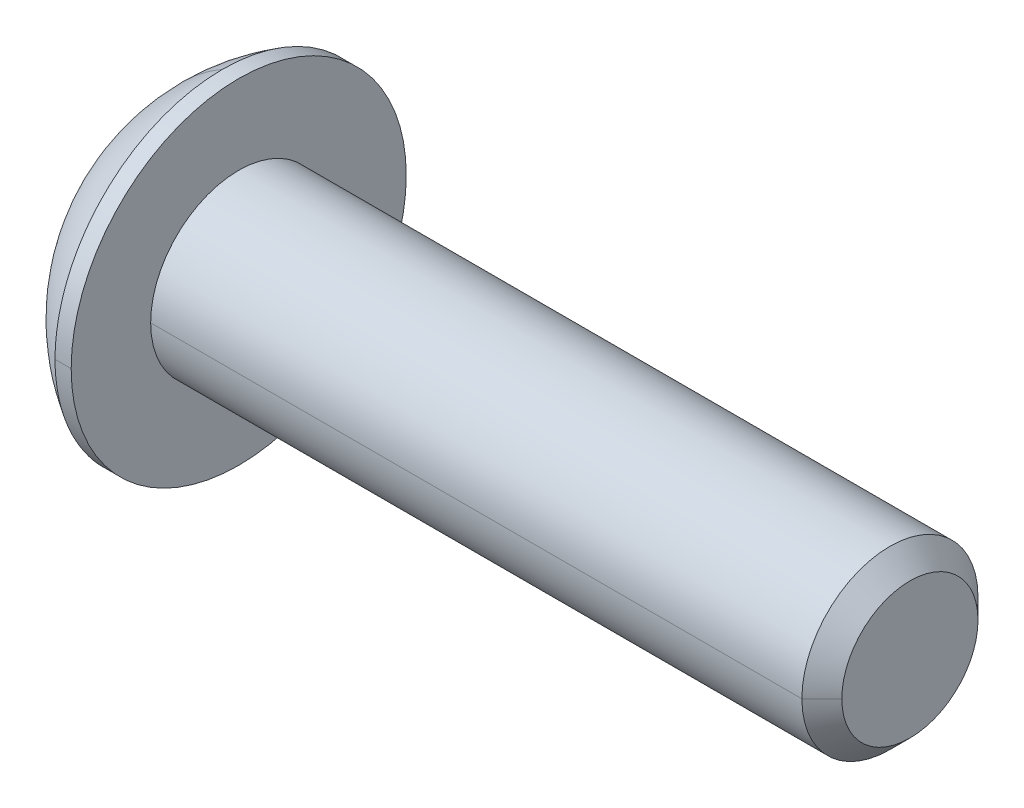
ISO-10303-21;
HEADER;
FILE_DESCRIPTION(('STEP AP214'),'2;1');
FILE_NAME('part.step','',(''),(''),'','','');
FILE_SCHEMA(('AUTOMOTIVE_DESIGN { 1 0 10303 214 1 1 1 1 }'));
ENDSEC;
DATA;
#1=APPLICATION_CONTEXT('core data for automotive mechanical design processes');
#2=APPLICATION_PROTOCOL_DEFINITION('international standard','automotive_design',2000,#1);
#3=PRODUCT_CONTEXT('',#1,'mechanical');
#4=PRODUCT('Part','Part','',(#3));
#5=PRODUCT_RELATED_PRODUCT_CATEGORY('part','',(#4));
#6=PRODUCT_DEFINITION_FORMATION('','',#4);
#7=PRODUCT_DEFINITION_CONTEXT('part definition',#1,'design');
#8=PRODUCT_DEFINITION('design','',#6,#7);
#9=PRODUCT_DEFINITION_SHAPE('','',#8);
#10=(LENGTH_UNIT() NAMED_UNIT(*) SI_UNIT(.MILLI.,.METRE.));
#11=(NAMED_UNIT(*) PLANE_ANGLE_UNIT() SI_UNIT($,.RADIAN.));
#12=(NAMED_UNIT(*) SI_UNIT($,.STERADIAN.) SOLID_ANGLE_UNIT());
#13=UNCERTAINTY_MEASURE_WITH_UNIT(LENGTH_MEASURE(1.E-05),#10,'distance_accuracy_value','');
#14=(GEOMETRIC_REPRESENTATION_CONTEXT(3) GLOBAL_UNCERTAINTY_ASSIGNED_CONTEXT((#13)) GLOBAL_UNIT_ASSIGNED_CONTEXT((#10,
#11,#12)) REPRESENTATION_CONTEXT('',''));
#15=CARTESIAN_POINT('',(0.,0.,0.));
#16=DIRECTION('',(0.,0.,1.));
#17=DIRECTION('',(1.,0.,0.));
#18=AXIS2_PLACEMENT_3D('',#15,#16,#17);
#19=CARTESIAN_POINT('',(18.0848,0.,0.));
#20=DIRECTION('',(-1.,0.,0.));
#21=DIRECTION('',(0.,0.,1.));
#22=AXIS2_PLACEMENT_3D('',#19,#20,#21);
#23=PLANE('',#22);
#24=CARTESIAN_POINT('',(18.0848,0.,0.));
#25=DIRECTION('',(-1.,0.,0.));
#26=DIRECTION('',(0.,0.,1.));
#27=AXIS2_PLACEMENT_3D('',#24,#25,#26);
#28=CIRCLE('',#27,1.61036);
#29=CARTESIAN_POINT('',(18.0848,0.,1.61036));
#30=VERTEX_POINT('',#29);
#31=CARTESIAN_POINT('',(18.0848,0.,-1.61036));
#32=VERTEX_POINT('',#31);
#33=EDGE_CURVE('E10',#30,#32,#28,.T.);
#34=ORIENTED_EDGE('',*,*,#33,.F.);
#35=CARTESIAN_POINT('',(18.0848,0.,0.));
#36=DIRECTION('',(-1.,0.,0.));
#37=DIRECTION('',(0.,0.,1.));
#38=AXIS2_PLACEMENT_3D('',#35,#36,#37);
#39=CIRCLE('',#38,1.61036);
#40=EDGE_CURVE('E245',#32,#30,#39,.T.);
#41=ORIENTED_EDGE('',*,*,#40,.F.);
#42=EDGE_LOOP('',(#34,#41));
#43=FACE_BOUND('',#42,.T.);
#44=ADVANCED_FACE('F15',(#43),#23,.F.);
#45=CARTESIAN_POINT('',(18.0848,0.,0.));
#46=DIRECTION('',(-1.,0.,0.));
#47=DIRECTION('',(0.,0.,1.));
#48=AXIS2_PLACEMENT_3D('',#45,#46,#47);
#49=CONICAL_SURFACE('',#48,1.61036,0.78539816339744);
#50=ORIENTED_EDGE('',*,*,#33,.T.);
#51=DIRECTION('',(-0.707106781186553,0.,-0.707106781186542));
#52=VECTOR('',#51,1.);
#53=CARTESIAN_POINT('',(18.0848,0.,-1.61036));
#54=LINE('',#53,#52);
#55=CARTESIAN_POINT('',(17.61236,0.,-2.0828));
#56=VERTEX_POINT('',#55);
#57=EDGE_CURVE('E213',#32,#56,#54,.T.);
#58=ORIENTED_EDGE('',*,*,#57,.T.);
#59=CARTESIAN_POINT('',(17.61236,0.,0.));
#60=DIRECTION('',(-1.,0.,0.));
#61=DIRECTION('',(0.,0.,1.));
#62=AXIS2_PLACEMENT_3D('',#59,#60,#61);
#63=CIRCLE('',#62,2.0828);
#64=CARTESIAN_POINT('',(17.61236,0.,2.0828));
#65=VERTEX_POINT('',#64);
#66=EDGE_CURVE('E209',#65,#56,#63,.T.);
#67=ORIENTED_EDGE('',*,*,#66,.F.);
#68=DIRECTION('',(-0.707106781186553,0.,0.707106781186542));
#69=VECTOR('',#68,1.);
#70=CARTESIAN_POINT('',(18.0848,0.,1.61036));
#71=LINE('',#70,#69);
#72=EDGE_CURVE('E26',#30,#65,#71,.T.);
#73=ORIENTED_EDGE('',*,*,#72,.F.);
#74=EDGE_LOOP('',(#50,#58,#67,#73));
#75=FACE_BOUND('',#74,.T.);
#76=ADVANCED_FACE('F589',(#75),#49,.T.);
#77=CARTESIAN_POINT('',(18.0848,0.,0.));
#78=DIRECTION('',(-1.,0.,0.));
#79=DIRECTION('',(0.,0.,1.));
#80=AXIS2_PLACEMENT_3D('',#77,#78,#79);
#81=CONICAL_SURFACE('',#80,1.61036,0.78539816339744);
#82=ORIENTED_EDGE('',*,*,#57,.F.);
#83=ORIENTED_EDGE('',*,*,#40,.T.);
#84=ORIENTED_EDGE('',*,*,#72,.T.);
#85=CARTESIAN_POINT('',(17.61236,0.,0.));
#86=DIRECTION('',(-1.,0.,0.));
#87=DIRECTION('',(0.,0.,1.));
#88=AXIS2_PLACEMENT_3D('',#85,#86,#87);
#89=CIRCLE('',#88,2.0828);
#90=EDGE_CURVE('E292',#56,#65,#89,.T.);
#91=ORIENTED_EDGE('',*,*,#90,.F.);
#92=EDGE_LOOP('',(#82,#83,#84,#91));
#93=FACE_BOUND('',#92,.T.);
#94=ADVANCED_FACE('F17',(#93),#81,.T.);
#95=CARTESIAN_POINT('',(0.,0.,0.));
#96=DIRECTION('',(-1.,0.,0.));
#97=DIRECTION('',(0.,0.,1.));
#98=AXIS2_PLACEMENT_3D('',#95,#96,#97);
#99=CYLINDRICAL_SURFACE('',#98,2.0828);
#100=ORIENTED_EDGE('',*,*,#66,.T.);
#101=DIRECTION('',(-1.,0.,0.));
#102=VECTOR('',#101,1.);
#103=CARTESIAN_POINT('',(0.,0.,-2.0828));
#104=LINE('',#103,#102);
#105=CARTESIAN_POINT('',(2.2098,0.,-2.0828));
#106=VERTEX_POINT('',#105);
#107=EDGE_CURVE('E269',#56,#106,#104,.T.);
#108=ORIENTED_EDGE('',*,*,#107,.T.);
#109=CARTESIAN_POINT('',(2.2098,0.,0.));
#110=DIRECTION('',(-1.,0.,0.));
#111=DIRECTION('',(0.,0.,1.));
#112=AXIS2_PLACEMENT_3D('',#109,#110,#111);
#113=CIRCLE('',#112,2.0828);
#114=CARTESIAN_POINT('',(2.2098,0.,2.0828));
#115=VERTEX_POINT('',#114);
#116=EDGE_CURVE('E200',#115,#106,#113,.T.);
#117=ORIENTED_EDGE('',*,*,#116,.F.);
#118=DIRECTION('',(-1.,0.,0.));
#119=VECTOR('',#118,1.);
#120=CARTESIAN_POINT('',(0.,0.,2.0828));
#121=LINE('',#120,#119);
#122=EDGE_CURVE('E214',#65,#115,#121,.T.);
#123=ORIENTED_EDGE('',*,*,#122,.F.);
#124=EDGE_LOOP('',(#100,#108,#117,#123));
#125=FACE_BOUND('',#124,.T.);
#126=ADVANCED_FACE('F497',(#125),#99,.T.);
#127=CARTESIAN_POINT('',(0.,0.,0.));
#128=DIRECTION('',(-1.,0.,0.));
#129=DIRECTION('',(0.,0.,1.));
#130=AXIS2_PLACEMENT_3D('',#127,#128,#129);
#131=CYLINDRICAL_SURFACE('',#130,2.0828);
#132=ORIENTED_EDGE('',*,*,#107,.F.);
#133=ORIENTED_EDGE('',*,*,#90,.T.);
#134=ORIENTED_EDGE('',*,*,#122,.T.);
#135=CARTESIAN_POINT('',(2.2098,0.,0.));
#136=DIRECTION('',(-1.,0.,0.));
#137=DIRECTION('',(0.,0.,1.));
#138=AXIS2_PLACEMENT_3D('',#135,#136,#137);
#139=CIRCLE('',#138,2.0828);
#140=EDGE_CURVE('E266',#106,#115,#139,.T.);
#141=ORIENTED_EDGE('',*,*,#140,.F.);
#142=EDGE_LOOP('',(#132,#133,#134,#141));
#143=FACE_BOUND('',#142,.T.);
#144=ADVANCED_FACE('F459',(#143),#131,.T.);
#145=CARTESIAN_POINT('',(2.2098,2.0828,0.));
#146=DIRECTION('',(-1.,0.,0.));
#147=DIRECTION('',(0.,0.,1.));
#148=AXIS2_PLACEMENT_3D('',#145,#146,#147);
#149=PLANE('',#148);
#150=ORIENTED_EDGE('',*,*,#116,.T.);
#151=ORIENTED_EDGE('',*,*,#140,.T.);
#152=EDGE_LOOP('',(#150,#151));
#153=FACE_BOUND('',#152,.T.);
#154=CARTESIAN_POINT('',(2.2098,0.,0.));
#155=DIRECTION('',(-1.,0.,0.));
#156=DIRECTION('',(0.,0.,1.));
#157=AXIS2_PLACEMENT_3D('',#154,#155,#156);
#158=CIRCLE('',#157,3.9624);
#159=CARTESIAN_POINT('',(2.2098,0.,3.9624));
#160=VERTEX_POINT('',#159);
#161=CARTESIAN_POINT('',(2.2098,0.,-3.9624));
#162=VERTEX_POINT('',#161);
#163=EDGE_CURVE('E237',#160,#162,#158,.T.);
#164=ORIENTED_EDGE('',*,*,#163,.F.);
#165=CARTESIAN_POINT('',(2.2098,0.,0.));
#166=DIRECTION('',(-1.,0.,0.));
#167=DIRECTION('',(0.,0.,1.));
#168=AXIS2_PLACEMENT_3D('',#165,#166,#167);
#169=CIRCLE('',#168,3.9624);
#170=EDGE_CURVE('E199',#162,#160,#169,.T.);
#171=ORIENTED_EDGE('',*,*,#170,.F.);
#172=EDGE_LOOP('',(#164,#171));
#173=FACE_BOUND('',#172,.T.);
#174=ADVANCED_FACE('F454',(#153,#173),#149,.F.);
#175=CARTESIAN_POINT('',(1.3208,-2.06772225407573,-1.1938));
#176=DIRECTION('',(1.,0.,0.));
#177=DIRECTION('',(0.,1.,0.));
#178=AXIS2_PLACEMENT_3D('',#175,#176,#177);
#179=PLANE('',#178);
#180=CARTESIAN_POINT('',(1.3208,0.,0.));
#181=DIRECTION('',(-1.,0.,0.));
#182=DIRECTION('',(0.,0.,1.));
#183=AXIS2_PLACEMENT_3D('',#180,#181,#182);
#184=CIRCLE('',#183,1.1938);
#185=CARTESIAN_POINT('',(1.3208,0.,-1.1938));
#186=VERTEX_POINT('',#185);
#187=CARTESIAN_POINT('',(1.3208,-1.03386112703786,-0.5969));
#188=VERTEX_POINT('',#187);
#189=EDGE_CURVE('E145',#186,#188,#184,.T.);
#190=ORIENTED_EDGE('',*,*,#189,.F.);
#191=DIRECTION('',(0.,1.,0.));
#192=VECTOR('',#191,1.);
#193=CARTESIAN_POINT('',(1.3208,0.689240751358577,-1.1938));
#194=LINE('',#193,#192);
#195=CARTESIAN_POINT('',(1.3208,-0.689240751358574,-1.1938));
#196=VERTEX_POINT('',#195);
#197=EDGE_CURVE('E176',#196,#186,#194,.T.);
#198=ORIENTED_EDGE('',*,*,#197,.F.);
#199=DIRECTION('',(0.,0.5,-0.866025403784439));
#200=VECTOR('',#199,1.);
#201=CARTESIAN_POINT('',(1.3208,-0.689240751358574,-1.1938));
#202=LINE('',#201,#200);
#203=EDGE_CURVE('E173',#188,#196,#202,.T.);
#204=ORIENTED_EDGE('',*,*,#203,.F.);
#205=EDGE_LOOP('',(#190,#198,#204));
#206=FACE_BOUND('',#205,.T.);
#207=ADVANCED_FACE('F174',(#206),#179,.F.);
#208=CARTESIAN_POINT('',(1.3208,-2.06772225407573,-1.1938));
#209=DIRECTION('',(1.,0.,0.));
#210=DIRECTION('',(0.,1.,0.));
#211=AXIS2_PLACEMENT_3D('',#208,#209,#210);
#212=PLANE('',#211);
#213=CARTESIAN_POINT('',(1.3208,0.,0.));
#214=DIRECTION('',(-1.,0.,0.));
#215=DIRECTION('',(0.,0.,1.));
#216=AXIS2_PLACEMENT_3D('',#213,#214,#215);
#217=CIRCLE('',#216,1.1938);
#218=CARTESIAN_POINT('',(1.3208,1.03386112703786,-0.5969));
#219=VERTEX_POINT('',#218);
#220=EDGE_CURVE('E242',#219,#186,#217,.T.);
#221=ORIENTED_EDGE('',*,*,#220,.F.);
#222=DIRECTION('',(0.,0.5,0.866025403784439));
#223=VECTOR('',#222,1.);
#224=CARTESIAN_POINT('',(1.3208,1.37848150271715,0.));
#225=LINE('',#224,#223);
#226=CARTESIAN_POINT('',(1.3208,0.689240751358577,-1.1938));
#227=VERTEX_POINT('',#226);
#228=EDGE_CURVE('E230',#227,#219,#225,.T.);
#229=ORIENTED_EDGE('',*,*,#228,.F.);
#230=DIRECTION('',(0.,1.,0.));
#231=VECTOR('',#230,1.);
#232=CARTESIAN_POINT('',(1.3208,0.689240751358577,-1.1938));
#233=LINE('',#232,#231);
#234=EDGE_CURVE('E170',#186,#227,#233,.T.);
#235=ORIENTED_EDGE('',*,*,#234,.F.);
#236=EDGE_LOOP('',(#221,#229,#235));
#237=FACE_BOUND('',#236,.T.);
#238=ADVANCED_FACE('F413',(#237),#212,.F.);
#239=CARTESIAN_POINT('',(0.,0.,0.));
#240=DIRECTION('',(-1.,0.,0.));
#241=DIRECTION('',(0.,0.,1.));
#242=AXIS2_PLACEMENT_3D('',#239,#240,#241);
#243=CYLINDRICAL_SURFACE('',#242,3.9624);
#244=DIRECTION('',(-1.,0.,0.));
#245=VECTOR('',#244,1.);
#246=CARTESIAN_POINT('',(0.,0.,-3.9624));
#247=LINE('',#246,#245);
#248=CARTESIAN_POINT('',(1.8288,0.,-3.9624));
#249=VERTEX_POINT('',#248);
#250=EDGE_CURVE('E241',#162,#249,#247,.T.);
#251=ORIENTED_EDGE('',*,*,#250,.F.);
#252=ORIENTED_EDGE('',*,*,#170,.T.);
#253=DIRECTION('',(-1.,0.,0.));
#254=VECTOR('',#253,1.);
#255=CARTESIAN_POINT('',(0.,0.,3.9624));
#256=LINE('',#255,#254);
#257=CARTESIAN_POINT('',(1.8288,0.,3.9624));
#258=VERTEX_POINT('',#257);
#259=EDGE_CURVE('E201',#160,#258,#256,.T.);
#260=ORIENTED_EDGE('',*,*,#259,.T.);
#261=CARTESIAN_POINT('',(1.8288,0.,0.));
#262=DIRECTION('',(-1.,0.,0.));
#263=DIRECTION('',(0.,0.,1.));
#264=AXIS2_PLACEMENT_3D('',#261,#262,#263);
#265=CIRCLE('',#264,3.9624);
#266=CARTESIAN_POINT('',(1.8288,-3.9624,0.));
#267=VERTEX_POINT('',#266);
#268=EDGE_CURVE('E281',#267,#258,#265,.T.);
#269=ORIENTED_EDGE('',*,*,#268,.F.);
#270=CARTESIAN_POINT('',(1.8288,0.,0.));
#271=DIRECTION('',(-1.,0.,0.));
#272=DIRECTION('',(0.,0.,1.));
#273=AXIS2_PLACEMENT_3D('',#270,#271,#272);
#274=CIRCLE('',#273,3.9624);
#275=EDGE_CURVE('E224',#249,#267,#274,.T.);
#276=ORIENTED_EDGE('',*,*,#275,.F.);
#277=EDGE_LOOP('',(#251,#252,#260,#269,#276));
#278=FACE_BOUND('',#277,.T.);
#279=ADVANCED_FACE('F400',(#278),#243,.T.);
#280=CARTESIAN_POINT('',(0.,0.,0.));
#281=DIRECTION('',(-1.,0.,0.));
#282=DIRECTION('',(0.,0.,1.));
#283=AXIS2_PLACEMENT_3D('',#280,#281,#282);
#284=CYLINDRICAL_SURFACE('',#283,3.9624);
#285=ORIENTED_EDGE('',*,*,#163,.T.);
#286=ORIENTED_EDGE('',*,*,#250,.T.);
#287=CARTESIAN_POINT('',(1.8288,0.,0.));
#288=DIRECTION('',(-1.,0.,0.));
#289=DIRECTION('',(0.,0.,1.));
#290=AXIS2_PLACEMENT_3D('',#287,#288,#289);
#291=CIRCLE('',#290,3.9624);
#292=CARTESIAN_POINT('',(1.8288,3.9624,0.));
#293=VERTEX_POINT('',#292);
#294=EDGE_CURVE('E220',#293,#249,#291,.T.);
#295=ORIENTED_EDGE('',*,*,#294,.F.);
#296=CARTESIAN_POINT('',(1.8288,0.,0.));
#297=DIRECTION('',(-1.,0.,0.));
#298=DIRECTION('',(0.,0.,1.));
#299=AXIS2_PLACEMENT_3D('',#296,#297,#298);
#300=CIRCLE('',#299,3.9624);
#301=EDGE_CURVE('E272',#258,#293,#300,.T.);
#302=ORIENTED_EDGE('',*,*,#301,.F.);
#303=ORIENTED_EDGE('',*,*,#259,.F.);
#304=EDGE_LOOP('',(#285,#286,#295,#302,#303));
#305=FACE_BOUND('',#304,.T.);
#306=ADVANCED_FACE('F393',(#305),#284,.T.);
#307=CARTESIAN_POINT('',(1.3208,-2.06772225407573,-1.1938));
#308=DIRECTION('',(1.,0.,0.));
#309=DIRECTION('',(0.,1.,0.));
#310=AXIS2_PLACEMENT_3D('',#307,#308,#309);
#311=PLANE('',#310);
#312=CARTESIAN_POINT('',(1.3208,0.,0.));
#313=DIRECTION('',(-1.,0.,0.));
#314=DIRECTION('',(0.,0.,1.));
#315=AXIS2_PLACEMENT_3D('',#312,#313,#314);
#316=CIRCLE('',#315,1.1938);
#317=CARTESIAN_POINT('',(1.3208,1.03386112703786,0.5969));
#318=VERTEX_POINT('',#317);
#319=EDGE_CURVE('E157',#318,#219,#316,.T.);
#320=ORIENTED_EDGE('',*,*,#319,.F.);
#321=DIRECTION('',(0.,-0.5,0.866025403784439));
#322=VECTOR('',#321,1.);
#323=CARTESIAN_POINT('',(1.3208,0.689240751358576,1.1938));
#324=LINE('',#323,#322);
#325=CARTESIAN_POINT('',(1.3208,1.37848150271715,0.));
#326=VERTEX_POINT('',#325);
#327=EDGE_CURVE('E203',#326,#318,#324,.T.);
#328=ORIENTED_EDGE('',*,*,#327,.F.);
#329=DIRECTION('',(0.,0.5,0.866025403784439));
#330=VECTOR('',#329,1.);
#331=CARTESIAN_POINT('',(1.3208,1.37848150271715,0.));
#332=LINE('',#331,#330);
#333=EDGE_CURVE('E194',#219,#326,#332,.T.);
#334=ORIENTED_EDGE('',*,*,#333,.F.);
#335=EDGE_LOOP('',(#320,#328,#334));
#336=FACE_BOUND('',#335,.T.);
#337=ADVANCED_FACE('F537',(#336),#311,.F.);
#338=CARTESIAN_POINT('',(-997.989959248641,0.,0.));
#339=DIRECTION('',(-1.,0.,0.));
#340=DIRECTION('',(0.,0.,1.));
#341=AXIS2_PLACEMENT_3D('',#338,#339,#340);
#342=CONICAL_SURFACE('',#341,1732.05080756886,1.0471975511966);
#343=DIRECTION('',(-0.5,0.,-0.866025403784436));
#344=VECTOR('',#343,1.);
#345=CARTESIAN_POINT('',(2.01004075135859,0.,0.));
#346=LINE('',#345,#344);
#347=CARTESIAN_POINT('',(2.01004075135859,0.,0.));
#348=VERTEX_POINT('',#347);
#349=EDGE_CURVE('E152',#348,#186,#346,.T.);
#350=ORIENTED_EDGE('',*,*,#349,.F.);
#351=DIRECTION('',(-0.5,0.,0.866025403784436));
#352=VECTOR('',#351,1.);
#353=CARTESIAN_POINT('',(2.01004075135859,0.,0.));
#354=LINE('',#353,#352);
#355=CARTESIAN_POINT('',(1.3208,0.,1.1938));
#356=VERTEX_POINT('',#355);
#357=EDGE_CURVE('E169',#348,#356,#354,.T.);
#358=ORIENTED_EDGE('',*,*,#357,.T.);
#359=CARTESIAN_POINT('',(1.3208,0.,0.));
#360=DIRECTION('',(-1.,0.,0.));
#361=DIRECTION('',(0.,0.,1.));
#362=AXIS2_PLACEMENT_3D('',#359,#360,#361);
#363=CIRCLE('',#362,1.1938);
#364=EDGE_CURVE('E276',#356,#318,#363,.T.);
#365=ORIENTED_EDGE('',*,*,#364,.T.);
#366=ORIENTED_EDGE('',*,*,#319,.T.);
#367=ORIENTED_EDGE('',*,*,#220,.T.);
#368=EDGE_LOOP('',(#350,#358,#365,#366,#367));
#369=FACE_BOUND('',#368,.T.);
#370=ADVANCED_FACE('F445',(#369),#342,.F.);
#371=CARTESIAN_POINT('',(-997.989959248641,0.,0.));
#372=DIRECTION('',(-1.,0.,0.));
#373=DIRECTION('',(0.,0.,1.));
#374=AXIS2_PLACEMENT_3D('',#371,#372,#373);
#375=CONICAL_SURFACE('',#374,1732.05080756886,1.0471975511966);
#376=ORIENTED_EDGE('',*,*,#357,.F.);
#377=ORIENTED_EDGE('',*,*,#349,.T.);
#378=ORIENTED_EDGE('',*,*,#189,.T.);
#379=CARTESIAN_POINT('',(1.3208,0.,0.));
#380=DIRECTION('',(-1.,0.,0.));
#381=DIRECTION('',(0.,0.,1.));
#382=AXIS2_PLACEMENT_3D('',#379,#380,#381);
#383=CIRCLE('',#382,1.1938);
#384=CARTESIAN_POINT('',(1.3208,-1.03386112703786,0.5969));
#385=VERTEX_POINT('',#384);
#386=EDGE_CURVE('E150',#188,#385,#383,.T.);
#387=ORIENTED_EDGE('',*,*,#386,.T.);
#388=CARTESIAN_POINT('',(1.3208,0.,0.));
#389=DIRECTION('',(-1.,0.,0.));
#390=DIRECTION('',(0.,0.,1.));
#391=AXIS2_PLACEMENT_3D('',#388,#389,#390);
#392=CIRCLE('',#391,1.1938);
#393=EDGE_CURVE('E273',#385,#356,#392,.T.);
#394=ORIENTED_EDGE('',*,*,#393,.T.);
#395=EDGE_LOOP('',(#376,#377,#378,#387,#394));
#396=FACE_BOUND('',#395,.T.);
#397=ADVANCED_FACE('F148',(#396),#375,.F.);
#398=CARTESIAN_POINT('',(1.3208,-2.06772225407573,-1.1938));
#399=DIRECTION('',(1.,0.,0.));
#400=DIRECTION('',(0.,1.,0.));
#401=AXIS2_PLACEMENT_3D('',#398,#399,#400);
#402=PLANE('',#401);
#403=ORIENTED_EDGE('',*,*,#386,.F.);
#404=DIRECTION('',(0.,0.5,-0.866025403784439));
#405=VECTOR('',#404,1.);
#406=CARTESIAN_POINT('',(1.3208,-0.689240751358574,-1.1938));
#407=LINE('',#406,#405);
#408=CARTESIAN_POINT('',(1.3208,-1.37848150271715,0.));
#409=VERTEX_POINT('',#408);
#410=EDGE_CURVE('E163',#409,#188,#407,.T.);
#411=ORIENTED_EDGE('',*,*,#410,.F.);
#412=DIRECTION('',(0.,-0.5,-0.866025403784439));
#413=VECTOR('',#412,1.);
#414=CARTESIAN_POINT('',(1.3208,-1.37848150271715,0.));
#415=LINE('',#414,#413);
#416=EDGE_CURVE('E166',#385,#409,#415,.T.);
#417=ORIENTED_EDGE('',*,*,#416,.F.);
#418=EDGE_LOOP('',(#403,#411,#417));
#419=FACE_BOUND('',#418,.T.);
#420=ADVANCED_FACE('F161',(#419),#402,.F.);
#421=CARTESIAN_POINT('',(1.3208,0.689240751358577,-1.1938));
#422=DIRECTION('',(0.,0.,1.));
#423=DIRECTION('',(1.,0.,0.));
#424=AXIS2_PLACEMENT_3D('',#421,#422,#423);
#425=PLANE('',#424);
#426=ORIENTED_EDGE('',*,*,#197,.T.);
#427=ORIENTED_EDGE('',*,*,#234,.T.);
#428=DIRECTION('',(-1.,0.,0.));
#429=VECTOR('',#428,1.);
#430=CARTESIAN_POINT('',(1.3208,0.689240751358577,-1.1938));
#431=LINE('',#430,#429);
#432=CARTESIAN_POINT('',(0.,0.689240751358577,-1.1938));
#433=VERTEX_POINT('',#432);
#434=EDGE_CURVE('E187',#227,#433,#431,.T.);
#435=ORIENTED_EDGE('',*,*,#434,.T.);
#436=DIRECTION('',(0.,1.,0.));
#437=VECTOR('',#436,1.);
#438=CARTESIAN_POINT('',(0.,0.689240751358577,-1.1938));
#439=LINE('',#438,#437);
#440=CARTESIAN_POINT('',(0.,-0.689240751358574,-1.1938));
#441=VERTEX_POINT('',#440);
#442=EDGE_CURVE('E229',#441,#433,#439,.T.);
#443=ORIENTED_EDGE('',*,*,#442,.F.);
#444=DIRECTION('',(-1.,0.,0.));
#445=VECTOR('',#444,1.);
#446=CARTESIAN_POINT('',(1.3208,-0.689240751358574,-1.1938));
#447=LINE('',#446,#445);
#448=EDGE_CURVE('E180',#196,#441,#447,.T.);
#449=ORIENTED_EDGE('',*,*,#448,.F.);
#450=EDGE_LOOP('',(#426,#427,#435,#443,#449));
#451=FACE_BOUND('',#450,.T.);
#452=ADVANCED_FACE('F510',(#451),#425,.T.);
#453=CARTESIAN_POINT('',(4.13385,0.,0.));
#454=DIRECTION('',(0.,0.,-1.));
#455=DIRECTION('',(0.,1.,0.));
#456=AXIS2_PLACEMENT_3D('',#453,#454,#455);
#457=SPHERICAL_SURFACE('',#456,4.58408870578439);
#458=CARTESIAN_POINT('',(4.13385,0.,0.));
#459=DIRECTION('',(0.,0.,-1.));
#460=DIRECTION('',(0.,1.,0.));
#461=AXIS2_PLACEMENT_3D('',#458,#459,#460);
#462=CIRCLE('',#461,4.58408870578439);
#463=CARTESIAN_POINT('',(0.,-1.9812,0.));
#464=VERTEX_POINT('',#463);
#465=EDGE_CURVE('E295',#267,#464,#462,.T.);
#466=ORIENTED_EDGE('',*,*,#465,.F.);
#467=ORIENTED_EDGE('',*,*,#268,.T.);
#468=ORIENTED_EDGE('',*,*,#301,.T.);
#469=CARTESIAN_POINT('',(4.13385,0.,0.));
#470=DIRECTION('',(0.,0.,1.));
#471=DIRECTION('',(1.,0.,0.));
#472=AXIS2_PLACEMENT_3D('',#469,#470,#471);
#473=CIRCLE('',#472,4.58408870578439);
#474=CARTESIAN_POINT('',(0.,1.9812,0.));
#475=VERTEX_POINT('',#474);
#476=EDGE_CURVE('E234',#293,#475,#473,.T.);
#477=ORIENTED_EDGE('',*,*,#476,.T.);
#478=CARTESIAN_POINT('',(0.,0.,0.));
#479=DIRECTION('',(-1.,0.,0.));
#480=DIRECTION('',(0.,0.,1.));
#481=AXIS2_PLACEMENT_3D('',#478,#479,#480);
#482=CIRCLE('',#481,1.9812);
#483=EDGE_CURVE('E215',#464,#475,#482,.T.);
#484=ORIENTED_EDGE('',*,*,#483,.F.);
#485=EDGE_LOOP('',(#466,#467,#468,#477,#484));
#486=FACE_BOUND('',#485,.T.);
#487=ADVANCED_FACE('F387',(#486),#457,.T.);
#488=CARTESIAN_POINT('',(1.3208,-0.689240751358574,-1.1938));
#489=DIRECTION('',(0.,0.866025403784439,0.5));
#490=DIRECTION('',(1.,0.,0.));
#491=AXIS2_PLACEMENT_3D('',#488,#489,#490);
#492=PLANE('',#491);
#493=ORIENTED_EDGE('',*,*,#410,.T.);
#494=ORIENTED_EDGE('',*,*,#203,.T.);
#495=ORIENTED_EDGE('',*,*,#448,.T.);
#496=DIRECTION('',(0.,0.5,-0.866025403784439));
#497=VECTOR('',#496,1.);
#498=CARTESIAN_POINT('',(0.,-0.689240751358574,-1.1938));
#499=LINE('',#498,#497);
#500=CARTESIAN_POINT('',(0.,-1.37848150271715,0.));
#501=VERTEX_POINT('',#500);
#502=EDGE_CURVE('E225',#501,#441,#499,.T.);
#503=ORIENTED_EDGE('',*,*,#502,.F.);
#504=DIRECTION('',(-1.,0.,0.));
#505=VECTOR('',#504,1.);
#506=CARTESIAN_POINT('',(1.3208,-1.37848150271715,0.));
#507=LINE('',#506,#505);
#508=EDGE_CURVE('E185',#409,#501,#507,.T.);
#509=ORIENTED_EDGE('',*,*,#508,.F.);
#510=EDGE_LOOP('',(#493,#494,#495,#503,#509));
#511=FACE_BOUND('',#510,.T.);
#512=ADVANCED_FACE('F182',(#511),#492,.T.);
#513=CARTESIAN_POINT('',(1.3208,1.37848150271715,0.));
#514=DIRECTION('',(0.,-0.866025403784439,0.5));
#515=DIRECTION('',(-1.,0.,0.));
#516=AXIS2_PLACEMENT_3D('',#513,#514,#515);
#517=PLANE('',#516);
#518=ORIENTED_EDGE('',*,*,#228,.T.);
#519=ORIENTED_EDGE('',*,*,#333,.T.);
#520=DIRECTION('',(-1.,0.,0.));
#521=VECTOR('',#520,1.);
#522=CARTESIAN_POINT('',(1.3208,1.37848150271715,0.));
#523=LINE('',#522,#521);
#524=CARTESIAN_POINT('',(0.,1.37848150271715,0.));
#525=VERTEX_POINT('',#524);
#526=EDGE_CURVE('E207',#326,#525,#523,.T.);
#527=ORIENTED_EDGE('',*,*,#526,.T.);
#528=DIRECTION('',(0.,0.5,0.866025403784439));
#529=VECTOR('',#528,1.);
#530=CARTESIAN_POINT('',(0.,1.37848150271715,0.));
#531=LINE('',#530,#529);
#532=EDGE_CURVE('E296',#433,#525,#531,.T.);
#533=ORIENTED_EDGE('',*,*,#532,.F.);
#534=ORIENTED_EDGE('',*,*,#434,.F.);
#535=EDGE_LOOP('',(#518,#519,#527,#533,#534));
#536=FACE_BOUND('',#535,.T.);
#537=ADVANCED_FACE('F488',(#536),#517,.T.);
#538=CARTESIAN_POINT('',(4.13385,0.,0.));
#539=DIRECTION('',(0.,0.,-1.));
#540=DIRECTION('',(0.,1.,0.));
#541=AXIS2_PLACEMENT_3D('',#538,#539,#540);
#542=SPHERICAL_SURFACE('',#541,4.58408870578439);
#543=ORIENTED_EDGE('',*,*,#294,.T.);
#544=ORIENTED_EDGE('',*,*,#275,.T.);
#545=ORIENTED_EDGE('',*,*,#465,.T.);
#546=CARTESIAN_POINT('',(0.,0.,0.));
#547=DIRECTION('',(-1.,0.,0.));
#548=DIRECTION('',(0.,0.,1.));
#549=AXIS2_PLACEMENT_3D('',#546,#547,#548);
#550=CIRCLE('',#549,1.9812);
#551=EDGE_CURVE('E19',#475,#464,#550,.T.);
#552=ORIENTED_EDGE('',*,*,#551,.F.);
#553=ORIENTED_EDGE('',*,*,#476,.F.);
#554=EDGE_LOOP('',(#543,#544,#545,#552,#553));
#555=FACE_BOUND('',#554,.T.);
#556=ADVANCED_FACE('F391',(#555),#542,.T.);
#557=CARTESIAN_POINT('',(1.3208,0.689240751358576,1.1938));
#558=DIRECTION('',(0.,-0.866025403784439,-0.5));
#559=DIRECTION('',(0.,0.5,-0.866025403784439));
#560=AXIS2_PLACEMENT_3D('',#557,#558,#559);
#561=PLANE('',#560);
#562=ORIENTED_EDGE('',*,*,#327,.T.);
#563=DIRECTION('',(0.,-0.5,0.866025403784439));
#564=VECTOR('',#563,1.);
#565=CARTESIAN_POINT('',(1.3208,0.689240751358576,1.1938));
#566=LINE('',#565,#564);
#567=CARTESIAN_POINT('',(1.3208,0.689240751358576,1.1938));
#568=VERTEX_POINT('',#567);
#569=EDGE_CURVE('E208',#318,#568,#566,.T.);
#570=ORIENTED_EDGE('',*,*,#569,.T.);
#571=DIRECTION('',(-1.,0.,0.));
#572=VECTOR('',#571,1.);
#573=CARTESIAN_POINT('',(1.3208,0.689240751358576,1.1938));
#574=LINE('',#573,#572);
#575=CARTESIAN_POINT('',(0.,0.689240751358576,1.1938));
#576=VERTEX_POINT('',#575);
#577=EDGE_CURVE('E319',#568,#576,#574,.T.);
#578=ORIENTED_EDGE('',*,*,#577,.T.);
#579=DIRECTION('',(0.,-0.5,0.866025403784439));
#580=VECTOR('',#579,1.);
#581=CARTESIAN_POINT('',(0.,0.689240751358576,1.1938));
#582=LINE('',#581,#580);
#583=EDGE_CURVE('E299',#525,#576,#582,.T.);
#584=ORIENTED_EDGE('',*,*,#583,.F.);
#585=ORIENTED_EDGE('',*,*,#526,.F.);
#586=EDGE_LOOP('',(#562,#570,#578,#584,#585));
#587=FACE_BOUND('',#586,.T.);
#588=ADVANCED_FACE('F474',(#587),#561,.T.);
#589=CARTESIAN_POINT('',(1.3208,-2.06772225407573,-1.1938));
#590=DIRECTION('',(1.,0.,0.));
#591=DIRECTION('',(0.,1.,0.));
#592=AXIS2_PLACEMENT_3D('',#589,#590,#591);
#593=PLANE('',#592);
#594=ORIENTED_EDGE('',*,*,#364,.F.);
#595=DIRECTION('',(0.,-1.,0.));
#596=VECTOR('',#595,1.);
#597=CARTESIAN_POINT('',(1.3208,-0.689240751358574,1.1938));
#598=LINE('',#597,#596);
#599=EDGE_CURVE('E285',#568,#356,#598,.T.);
#600=ORIENTED_EDGE('',*,*,#599,.F.);
#601=ORIENTED_EDGE('',*,*,#569,.F.);
#602=EDGE_LOOP('',(#594,#600,#601));
#603=FACE_BOUND('',#602,.T.);
#604=ADVANCED_FACE('F468',(#603),#593,.F.);
#605=CARTESIAN_POINT('',(1.3208,-2.06772225407573,-1.1938));
#606=DIRECTION('',(1.,0.,0.));
#607=DIRECTION('',(0.,1.,0.));
#608=AXIS2_PLACEMENT_3D('',#605,#606,#607);
#609=PLANE('',#608);
#610=ORIENTED_EDGE('',*,*,#393,.F.);
#611=DIRECTION('',(0.,-0.5,-0.866025403784439));
#612=VECTOR('',#611,1.);
#613=CARTESIAN_POINT('',(1.3208,-1.37848150271715,0.));
#614=LINE('',#613,#612);
#615=CARTESIAN_POINT('',(1.3208,-0.689240751358574,1.1938));
#616=VERTEX_POINT('',#615);
#617=EDGE_CURVE('E306',#616,#385,#614,.T.);
#618=ORIENTED_EDGE('',*,*,#617,.F.);
#619=DIRECTION('',(0.,-1.,0.));
#620=VECTOR('',#619,1.);
#621=CARTESIAN_POINT('',(1.3208,-0.689240751358574,1.1938));
#622=LINE('',#621,#620);
#623=EDGE_CURVE('E289',#356,#616,#622,.T.);
#624=ORIENTED_EDGE('',*,*,#623,.F.);
#625=EDGE_LOOP('',(#610,#618,#624));
#626=FACE_BOUND('',#625,.T.);
#627=ADVANCED_FACE('F473',(#626),#609,.F.);
#628=CARTESIAN_POINT('',(1.3208,-1.37848150271715,0.));
#629=DIRECTION('',(0.,0.866025403784439,-0.5));
#630=DIRECTION('',(-1.,0.,0.));
#631=AXIS2_PLACEMENT_3D('',#628,#629,#630);
#632=PLANE('',#631);
#633=ORIENTED_EDGE('',*,*,#617,.T.);
#634=ORIENTED_EDGE('',*,*,#416,.T.);
#635=ORIENTED_EDGE('',*,*,#508,.T.);
#636=DIRECTION('',(0.,-0.5,-0.866025403784439));
#637=VECTOR('',#636,1.);
#638=CARTESIAN_POINT('',(0.,-1.37848150271715,0.));
#639=LINE('',#638,#637);
#640=CARTESIAN_POINT('',(0.,-0.689240751358574,1.1938));
#641=VERTEX_POINT('',#640);
#642=EDGE_CURVE('E219',#641,#501,#639,.T.);
#643=ORIENTED_EDGE('',*,*,#642,.F.);
#644=DIRECTION('',(-1.,0.,0.));
#645=VECTOR('',#644,1.);
#646=CARTESIAN_POINT('',(1.3208,-0.689240751358574,1.1938));
#647=LINE('',#646,#645);
#648=EDGE_CURVE('E354',#616,#641,#647,.T.);
#649=ORIENTED_EDGE('',*,*,#648,.F.);
#650=EDGE_LOOP('',(#633,#634,#635,#643,#649));
#651=FACE_BOUND('',#650,.T.);
#652=ADVANCED_FACE('F525',(#651),#632,.T.);
#653=CARTESIAN_POINT('',(0.,0.,0.));
#654=DIRECTION('',(-1.,0.,0.));
#655=DIRECTION('',(0.,0.,1.));
#656=AXIS2_PLACEMENT_3D('',#653,#654,#655);
#657=PLANE('',#656);
#658=DIRECTION('',(0.,-1.,0.));
#659=VECTOR('',#658,1.);
#660=CARTESIAN_POINT('',(0.,-0.689240751358574,1.1938));
#661=LINE('',#660,#659);
#662=EDGE_CURVE('E264',#576,#641,#661,.T.);
#663=ORIENTED_EDGE('',*,*,#662,.T.);
#664=ORIENTED_EDGE('',*,*,#642,.T.);
#665=ORIENTED_EDGE('',*,*,#502,.T.);
#666=ORIENTED_EDGE('',*,*,#442,.T.);
#667=ORIENTED_EDGE('',*,*,#532,.T.);
#668=ORIENTED_EDGE('',*,*,#583,.T.);
#669=EDGE_LOOP('',(#663,#664,#665,#666,#667,#668));
#670=FACE_BOUND('',#669,.T.);
#671=ORIENTED_EDGE('',*,*,#551,.T.);
#672=ORIENTED_EDGE('',*,*,#483,.T.);
#673=EDGE_LOOP('',(#671,#672));
#674=FACE_BOUND('',#673,.T.);
#675=ADVANCED_FACE('F404',(#670,#674),#657,.T.);
#676=CARTESIAN_POINT('',(1.3208,-0.689240751358574,1.1938));
#677=DIRECTION('',(0.,0.,-1.));
#678=DIRECTION('',(-1.,0.,0.));
#679=AXIS2_PLACEMENT_3D('',#676,#677,#678);
#680=PLANE('',#679);
#681=ORIENTED_EDGE('',*,*,#599,.T.);
#682=ORIENTED_EDGE('',*,*,#623,.T.);
#683=ORIENTED_EDGE('',*,*,#648,.T.);
#684=ORIENTED_EDGE('',*,*,#662,.F.);
#685=ORIENTED_EDGE('',*,*,#577,.F.);
#686=EDGE_LOOP('',(#681,#682,#683,#684,#685));
#687=FACE_BOUND('',#686,.T.);
#688=ADVANCED_FACE('F428',(#687),#680,.T.);
#689=CLOSED_SHELL('',(#44,#76,#94,#126,#144,#174,#207,#238,#279,#306,#337,#370,#397,#420,#452,
#487,#512,#537,#556,#588,#604,#627,#652,#675,#688));
#690=MANIFOLD_SOLID_BREP('B1',#689);
#691=ADVANCED_BREP_SHAPE_REPRESENTATION('',(#18,#690),#14);
#692=SHAPE_DEFINITION_REPRESENTATION(#9,#691);
ENDSEC;
END-ISO-10303-21;
